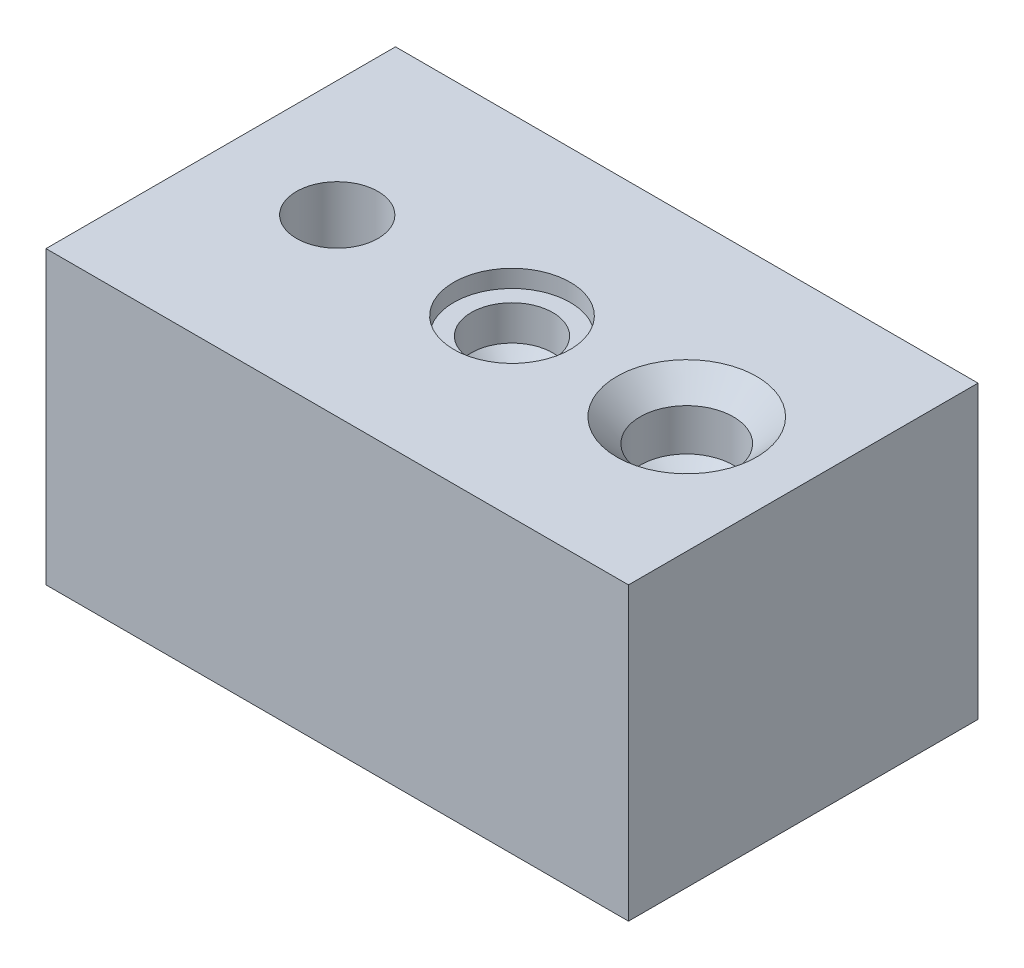
ISO-10303-21;
HEADER;
FILE_DESCRIPTION(('STEP AP214'),'2;1');
FILE_NAME('part.step','',(''),(''),'','','');
FILE_SCHEMA(('AUTOMOTIVE_DESIGN { 1 0 10303 214 1 1 1 1 }'));
ENDSEC;
DATA;
#1=APPLICATION_CONTEXT('core data for automotive mechanical design processes');
#2=APPLICATION_PROTOCOL_DEFINITION('international standard','automotive_design',2000,#1);
#3=PRODUCT_CONTEXT('',#1,'mechanical');
#4=PRODUCT('Part','Part','',(#3));
#5=PRODUCT_RELATED_PRODUCT_CATEGORY('part','',(#4));
#6=PRODUCT_DEFINITION_FORMATION('','',#4);
#7=PRODUCT_DEFINITION_CONTEXT('part definition',#1,'design');
#8=PRODUCT_DEFINITION('design','',#6,#7);
#9=PRODUCT_DEFINITION_SHAPE('','',#8);
#10=(LENGTH_UNIT() NAMED_UNIT(*) SI_UNIT(.MILLI.,.METRE.));
#11=(NAMED_UNIT(*) PLANE_ANGLE_UNIT() SI_UNIT($,.RADIAN.));
#12=(NAMED_UNIT(*) SI_UNIT($,.STERADIAN.) SOLID_ANGLE_UNIT());
#13=UNCERTAINTY_MEASURE_WITH_UNIT(LENGTH_MEASURE(1.E-05),#10,'distance_accuracy_value','');
#14=(GEOMETRIC_REPRESENTATION_CONTEXT(3) GLOBAL_UNCERTAINTY_ASSIGNED_CONTEXT((#13)) GLOBAL_UNIT_ASSIGNED_CONTEXT((#10,
#11,#12)) REPRESENTATION_CONTEXT('',''));
#15=CARTESIAN_POINT('',(0.,0.,0.));
#16=DIRECTION('',(0.,0.,1.));
#17=DIRECTION('',(1.,0.,0.));
#18=AXIS2_PLACEMENT_3D('',#15,#16,#17);
#19=CARTESIAN_POINT('',(0.,50.,0.));
#20=DIRECTION('',(-1.,0.,0.));
#21=DIRECTION('',(0.,0.,1.));
#22=AXIS2_PLACEMENT_3D('',#19,#20,#21);
#23=PLANE('',#22);
#24=DIRECTION('',(0.,0.,-1.));
#25=VECTOR('',#24,1.);
#26=CARTESIAN_POINT('',(0.,0.,0.));
#27=LINE('',#26,#25);
#28=CARTESIAN_POINT('',(0.,0.,0.));
#29=VERTEX_POINT('',#28);
#30=CARTESIAN_POINT('',(0.,0.,-60.));
#31=VERTEX_POINT('',#30);
#32=EDGE_CURVE('E129',#29,#31,#27,.T.);
#33=ORIENTED_EDGE('',*,*,#32,.T.);
#34=DIRECTION('',(0.,-1.,0.));
#35=VECTOR('',#34,1.);
#36=CARTESIAN_POINT('',(0.,50.,-60.));
#37=LINE('',#36,#35);
#38=CARTESIAN_POINT('',(0.,50.,-60.));
#39=VERTEX_POINT('',#38);
#40=EDGE_CURVE('E11',#39,#31,#37,.T.);
#41=ORIENTED_EDGE('',*,*,#40,.F.);
#42=DIRECTION('',(0.,0.,-1.));
#43=VECTOR('',#42,1.);
#44=CARTESIAN_POINT('',(0.,50.,0.));
#45=LINE('',#44,#43);
#46=CARTESIAN_POINT('',(0.,50.,0.));
#47=VERTEX_POINT('',#46);
#48=EDGE_CURVE('E130',#47,#39,#45,.T.);
#49=ORIENTED_EDGE('',*,*,#48,.F.);
#50=DIRECTION('',(0.,-1.,0.));
#51=VECTOR('',#50,1.);
#52=CARTESIAN_POINT('',(0.,50.,0.));
#53=LINE('',#52,#51);
#54=EDGE_CURVE('E140',#47,#29,#53,.T.);
#55=ORIENTED_EDGE('',*,*,#54,.T.);
#56=EDGE_LOOP('',(#33,#41,#49,#55));
#57=FACE_BOUND('',#56,.T.);
#58=ADVANCED_FACE('F39',(#57),#23,.F.);
#59=CARTESIAN_POINT('',(0.,50.,-60.));
#60=DIRECTION('',(0.,0.,1.));
#61=DIRECTION('',(1.,0.,0.));
#62=AXIS2_PLACEMENT_3D('',#59,#60,#61);
#63=PLANE('',#62);
#64=DIRECTION('',(-1.,0.,0.));
#65=VECTOR('',#64,1.);
#66=CARTESIAN_POINT('',(0.,0.,-60.));
#67=LINE('',#66,#65);
#68=CARTESIAN_POINT('',(-100.,0.,-60.));
#69=VERTEX_POINT('',#68);
#70=EDGE_CURVE('E144',#31,#69,#67,.T.);
#71=ORIENTED_EDGE('',*,*,#70,.T.);
#72=DIRECTION('',(0.,-1.,0.));
#73=VECTOR('',#72,1.);
#74=CARTESIAN_POINT('',(-100.,50.,-60.));
#75=LINE('',#74,#73);
#76=CARTESIAN_POINT('',(-100.,50.,-60.));
#77=VERTEX_POINT('',#76);
#78=EDGE_CURVE('E48',#77,#69,#75,.T.);
#79=ORIENTED_EDGE('',*,*,#78,.F.);
#80=DIRECTION('',(-1.,0.,0.));
#81=VECTOR('',#80,1.);
#82=CARTESIAN_POINT('',(0.,50.,-60.));
#83=LINE('',#82,#81);
#84=EDGE_CURVE('E87',#39,#77,#83,.T.);
#85=ORIENTED_EDGE('',*,*,#84,.F.);
#86=ORIENTED_EDGE('',*,*,#40,.T.);
#87=EDGE_LOOP('',(#71,#79,#85,#86));
#88=FACE_BOUND('',#87,.T.);
#89=ADVANCED_FACE('F174',(#88),#63,.F.);
#90=CARTESIAN_POINT('',(-100.,50.,0.));
#91=DIRECTION('',(1.,0.,0.));
#92=DIRECTION('',(0.,0.,-1.));
#93=AXIS2_PLACEMENT_3D('',#90,#91,#92);
#94=PLANE('',#93);
#95=DIRECTION('',(0.,0.,1.));
#96=VECTOR('',#95,1.);
#97=CARTESIAN_POINT('',(-100.,0.,0.));
#98=LINE('',#97,#96);
#99=CARTESIAN_POINT('',(-100.,0.,0.));
#100=VERTEX_POINT('',#99);
#101=EDGE_CURVE('E74',#69,#100,#98,.T.);
#102=ORIENTED_EDGE('',*,*,#101,.T.);
#103=DIRECTION('',(0.,-1.,0.));
#104=VECTOR('',#103,1.);
#105=CARTESIAN_POINT('',(-100.,50.,0.));
#106=LINE('',#105,#104);
#107=CARTESIAN_POINT('',(-100.,50.,0.));
#108=VERTEX_POINT('',#107);
#109=EDGE_CURVE('E153',#108,#100,#106,.T.);
#110=ORIENTED_EDGE('',*,*,#109,.F.);
#111=DIRECTION('',(0.,0.,1.));
#112=VECTOR('',#111,1.);
#113=CARTESIAN_POINT('',(-100.,50.,0.));
#114=LINE('',#113,#112);
#115=EDGE_CURVE('E135',#77,#108,#114,.T.);
#116=ORIENTED_EDGE('',*,*,#115,.F.);
#117=ORIENTED_EDGE('',*,*,#78,.T.);
#118=EDGE_LOOP('',(#102,#110,#116,#117));
#119=FACE_BOUND('',#118,.T.);
#120=ADVANCED_FACE('F157',(#119),#94,.F.);
#121=CARTESIAN_POINT('',(0.,50.,0.));
#122=DIRECTION('',(0.,0.,-1.));
#123=DIRECTION('',(-1.,0.,0.));
#124=AXIS2_PLACEMENT_3D('',#121,#122,#123);
#125=PLANE('',#124);
#126=DIRECTION('',(1.,0.,0.));
#127=VECTOR('',#126,1.);
#128=CARTESIAN_POINT('',(0.,0.,0.));
#129=LINE('',#128,#127);
#130=EDGE_CURVE('E80',#100,#29,#129,.T.);
#131=ORIENTED_EDGE('',*,*,#130,.T.);
#132=ORIENTED_EDGE('',*,*,#54,.F.);
#133=DIRECTION('',(1.,0.,0.));
#134=VECTOR('',#133,1.);
#135=CARTESIAN_POINT('',(0.,50.,0.));
#136=LINE('',#135,#134);
#137=EDGE_CURVE('E56',#108,#47,#136,.T.);
#138=ORIENTED_EDGE('',*,*,#137,.F.);
#139=ORIENTED_EDGE('',*,*,#109,.T.);
#140=EDGE_LOOP('',(#131,#132,#138,#139));
#141=FACE_BOUND('',#140,.T.);
#142=ADVANCED_FACE('F164',(#141),#125,.F.);
#143=CARTESIAN_POINT('',(0.,50.,0.));
#144=DIRECTION('',(0.,1.,0.));
#145=DIRECTION('',(0.,0.,1.));
#146=AXIS2_PLACEMENT_3D('',#143,#144,#145);
#147=PLANE('',#146);
#148=CARTESIAN_POINT('',(-80.,50.,-30.));
#149=DIRECTION('',(0.,1.,0.));
#150=DIRECTION('',(0.,0.,1.));
#151=AXIS2_PLACEMENT_3D('',#148,#149,#150);
#152=CIRCLE('',#151,6.99999999999999);
#153=CARTESIAN_POINT('',(-80.,50.,-23.));
#154=VERTEX_POINT('',#153);
#155=EDGE_CURVE('E288',#154,#154,#152,.T.);
#156=ORIENTED_EDGE('',*,*,#155,.F.);
#157=EDGE_LOOP('',(#156));
#158=FACE_BOUND('',#157,.T.);
#159=CARTESIAN_POINT('',(-20.,50.,-30.));
#160=DIRECTION('',(0.,1.,0.));
#161=DIRECTION('',(0.,0.,1.));
#162=AXIS2_PLACEMENT_3D('',#159,#160,#161);
#163=CIRCLE('',#162,12.);
#164=CARTESIAN_POINT('',(-20.,50.,-18.));
#165=VERTEX_POINT('',#164);
#166=EDGE_CURVE('E114',#165,#165,#163,.T.);
#167=ORIENTED_EDGE('',*,*,#166,.F.);
#168=EDGE_LOOP('',(#167));
#169=FACE_BOUND('',#168,.T.);
#170=CARTESIAN_POINT('',(-50.,50.,-30.));
#171=DIRECTION('',(0.,1.,0.));
#172=DIRECTION('',(0.,0.,1.));
#173=AXIS2_PLACEMENT_3D('',#170,#171,#172);
#174=CIRCLE('',#173,10.);
#175=CARTESIAN_POINT('',(-50.,50.,-20.));
#176=VERTEX_POINT('',#175);
#177=EDGE_CURVE('E105',#176,#176,#174,.T.);
#178=ORIENTED_EDGE('',*,*,#177,.F.);
#179=EDGE_LOOP('',(#178));
#180=FACE_BOUND('',#179,.T.);
#181=ORIENTED_EDGE('',*,*,#48,.T.);
#182=ORIENTED_EDGE('',*,*,#84,.T.);
#183=ORIENTED_EDGE('',*,*,#115,.T.);
#184=ORIENTED_EDGE('',*,*,#137,.T.);
#185=EDGE_LOOP('',(#181,#182,#183,#184));
#186=FACE_BOUND('',#185,.T.);
#187=ADVANCED_FACE('F166',(#158,#169,#180,#186),#147,.T.);
#188=CARTESIAN_POINT('',(0.,0.,0.));
#189=DIRECTION('',(0.,1.,0.));
#190=DIRECTION('',(0.,0.,1.));
#191=AXIS2_PLACEMENT_3D('',#188,#189,#190);
#192=PLANE('',#191);
#193=CARTESIAN_POINT('',(-80.,0.,-30.));
#194=DIRECTION('',(0.,1.,0.));
#195=DIRECTION('',(0.,0.,1.));
#196=AXIS2_PLACEMENT_3D('',#193,#194,#195);
#197=CIRCLE('',#196,6.99999999999999);
#198=CARTESIAN_POINT('',(-80.,0.,-23.));
#199=VERTEX_POINT('',#198);
#200=EDGE_CURVE('E285',#199,#199,#197,.T.);
#201=ORIENTED_EDGE('',*,*,#200,.T.);
#202=EDGE_LOOP('',(#201));
#203=FACE_BOUND('',#202,.T.);
#204=ORIENTED_EDGE('',*,*,#32,.F.);
#205=ORIENTED_EDGE('',*,*,#130,.F.);
#206=ORIENTED_EDGE('',*,*,#101,.F.);
#207=ORIENTED_EDGE('',*,*,#70,.F.);
#208=EDGE_LOOP('',(#204,#205,#206,#207));
#209=FACE_BOUND('',#208,.T.);
#210=ADVANCED_FACE('F160',(#203,#209),#192,.F.);
#211=CARTESIAN_POINT('',(-50.,41.,-30.));
#212=DIRECTION('',(0.,1.,0.));
#213=DIRECTION('',(0.,0.,1.));
#214=AXIS2_PLACEMENT_3D('',#211,#212,#213);
#215=CONICAL_SURFACE('',#214,7.,0.78539816339745);
#216=CARTESIAN_POINT('',(-50.,34.,-30.));
#217=VERTEX_POINT('',#216);
#218=VERTEX_LOOP('',#217);
#219=FACE_BOUND('',#218,.T.);
#220=CARTESIAN_POINT('',(-50.,41.,-30.));
#221=DIRECTION('',(0.,1.,0.));
#222=DIRECTION('',(0.,0.,1.));
#223=AXIS2_PLACEMENT_3D('',#220,#221,#222);
#224=CIRCLE('',#223,7.);
#225=CARTESIAN_POINT('',(-50.,41.,-23.));
#226=VERTEX_POINT('',#225);
#227=EDGE_CURVE('E125',#226,#226,#224,.T.);
#228=ORIENTED_EDGE('',*,*,#227,.T.);
#229=EDGE_LOOP('',(#228));
#230=FACE_BOUND('',#229,.T.);
#231=ADVANCED_FACE('F197',(#219,#230),#215,.F.);
#232=CARTESIAN_POINT('',(-50.,50.,-30.));
#233=DIRECTION('',(0.,1.,0.));
#234=DIRECTION('',(0.,0.,1.));
#235=AXIS2_PLACEMENT_3D('',#232,#233,#234);
#236=CYLINDRICAL_SURFACE('',#235,7.);
#237=ORIENTED_EDGE('',*,*,#227,.F.);
#238=EDGE_LOOP('',(#237));
#239=FACE_BOUND('',#238,.T.);
#240=CARTESIAN_POINT('',(-50.,47.,-30.));
#241=DIRECTION('',(0.,1.,0.));
#242=DIRECTION('',(0.,0.,1.));
#243=AXIS2_PLACEMENT_3D('',#240,#241,#242);
#244=CIRCLE('',#243,7.);
#245=CARTESIAN_POINT('',(-50.,47.,-23.));
#246=VERTEX_POINT('',#245);
#247=EDGE_CURVE('E121',#246,#246,#244,.T.);
#248=ORIENTED_EDGE('',*,*,#247,.T.);
#249=EDGE_LOOP('',(#248));
#250=FACE_BOUND('',#249,.T.);
#251=ADVANCED_FACE('F202',(#239,#250),#236,.F.);
#252=CARTESIAN_POINT('',(-43.,47.,-30.));
#253=DIRECTION('',(0.,-1.,0.));
#254=DIRECTION('',(0.,0.,-1.));
#255=AXIS2_PLACEMENT_3D('',#252,#253,#254);
#256=PLANE('',#255);
#257=ORIENTED_EDGE('',*,*,#247,.F.);
#258=EDGE_LOOP('',(#257));
#259=FACE_BOUND('',#258,.T.);
#260=CARTESIAN_POINT('',(-50.,47.,-30.));
#261=DIRECTION('',(0.,1.,0.));
#262=DIRECTION('',(0.,0.,1.));
#263=AXIS2_PLACEMENT_3D('',#260,#261,#262);
#264=CIRCLE('',#263,10.);
#265=CARTESIAN_POINT('',(-50.,47.,-20.));
#266=VERTEX_POINT('',#265);
#267=EDGE_CURVE('E111',#266,#266,#264,.T.);
#268=ORIENTED_EDGE('',*,*,#267,.T.);
#269=EDGE_LOOP('',(#268));
#270=FACE_BOUND('',#269,.T.);
#271=ADVANCED_FACE('F214',(#259,#270),#256,.F.);
#272=CARTESIAN_POINT('',(-50.,50.,-30.));
#273=DIRECTION('',(0.,1.,0.));
#274=DIRECTION('',(0.,0.,1.));
#275=AXIS2_PLACEMENT_3D('',#272,#273,#274);
#276=CYLINDRICAL_SURFACE('',#275,10.);
#277=ORIENTED_EDGE('',*,*,#267,.F.);
#278=EDGE_LOOP('',(#277));
#279=FACE_BOUND('',#278,.T.);
#280=ORIENTED_EDGE('',*,*,#177,.T.);
#281=EDGE_LOOP('',(#280));
#282=FACE_BOUND('',#281,.T.);
#283=ADVANCED_FACE('F98',(#279,#282),#276,.F.);
#284=CARTESIAN_POINT('',(-20.,38.8068849522205,-30.));
#285=DIRECTION('',(0.,1.,0.));
#286=DIRECTION('',(0.,0.,1.));
#287=AXIS2_PLACEMENT_3D('',#284,#285,#286);
#288=CONICAL_SURFACE('',#287,8.,1.02974425867666);
#289=CARTESIAN_POINT('',(-20.,34.,-30.));
#290=VERTEX_POINT('',#289);
#291=VERTEX_LOOP('',#290);
#292=FACE_BOUND('',#291,.T.);
#293=CARTESIAN_POINT('',(-20.,38.8068849522205,-30.));
#294=DIRECTION('',(0.,1.,0.));
#295=DIRECTION('',(0.,0.,1.));
#296=AXIS2_PLACEMENT_3D('',#293,#294,#295);
#297=CIRCLE('',#296,8.);
#298=CARTESIAN_POINT('',(-20.,38.8068849522205,-22.));
#299=VERTEX_POINT('',#298);
#300=EDGE_CURVE('E102',#299,#299,#297,.T.);
#301=ORIENTED_EDGE('',*,*,#300,.T.);
#302=EDGE_LOOP('',(#301));
#303=FACE_BOUND('',#302,.T.);
#304=ADVANCED_FACE('F94',(#292,#303),#288,.F.);
#305=CARTESIAN_POINT('',(-20.,50.,-30.));
#306=DIRECTION('',(0.,1.,0.));
#307=DIRECTION('',(0.,0.,1.));
#308=AXIS2_PLACEMENT_3D('',#305,#306,#307);
#309=CYLINDRICAL_SURFACE('',#308,8.);
#310=ORIENTED_EDGE('',*,*,#300,.F.);
#311=EDGE_LOOP('',(#310));
#312=FACE_BOUND('',#311,.T.);
#313=CARTESIAN_POINT('',(-20.,46.,-30.));
#314=DIRECTION('',(0.,1.,0.));
#315=DIRECTION('',(0.,0.,1.));
#316=AXIS2_PLACEMENT_3D('',#313,#314,#315);
#317=CIRCLE('',#316,8.);
#318=CARTESIAN_POINT('',(-20.,46.,-22.));
#319=VERTEX_POINT('',#318);
#320=EDGE_CURVE('E106',#319,#319,#317,.T.);
#321=ORIENTED_EDGE('',*,*,#320,.T.);
#322=EDGE_LOOP('',(#321));
#323=FACE_BOUND('',#322,.T.);
#324=ADVANCED_FACE('F97',(#312,#323),#309,.F.);
#325=CARTESIAN_POINT('',(-20.,50.,-30.));
#326=DIRECTION('',(0.,1.,0.));
#327=DIRECTION('',(0.,0.,1.));
#328=AXIS2_PLACEMENT_3D('',#325,#326,#327);
#329=CONICAL_SURFACE('',#328,12.,0.785398163397451);
#330=ORIENTED_EDGE('',*,*,#320,.F.);
#331=EDGE_LOOP('',(#330));
#332=FACE_BOUND('',#331,.T.);
#333=ORIENTED_EDGE('',*,*,#166,.T.);
#334=EDGE_LOOP('',(#333));
#335=FACE_BOUND('',#334,.T.);
#336=ADVANCED_FACE('F248',(#332,#335),#329,.F.);
#337=CARTESIAN_POINT('',(-80.,50.,-30.));
#338=DIRECTION('',(0.,1.,0.));
#339=DIRECTION('',(0.,0.,1.));
#340=AXIS2_PLACEMENT_3D('',#337,#338,#339);
#341=CYLINDRICAL_SURFACE('',#340,6.99999999999999);
#342=ORIENTED_EDGE('',*,*,#200,.F.);
#343=EDGE_LOOP('',(#342));
#344=FACE_BOUND('',#343,.T.);
#345=ORIENTED_EDGE('',*,*,#155,.T.);
#346=EDGE_LOOP('',(#345));
#347=FACE_BOUND('',#346,.T.);
#348=ADVANCED_FACE('F257',(#344,#347),#341,.F.);
#349=CLOSED_SHELL('',(#58,#89,#120,#142,#187,#210,#231,#251,#271,#283,#304,#324,#336,#348));
#350=MANIFOLD_SOLID_BREP('B2',#349);
#351=ADVANCED_BREP_SHAPE_REPRESENTATION('',(#18,#350),#14);
#352=SHAPE_DEFINITION_REPRESENTATION(#9,#351);
ENDSEC;
END-ISO-10303-21;
